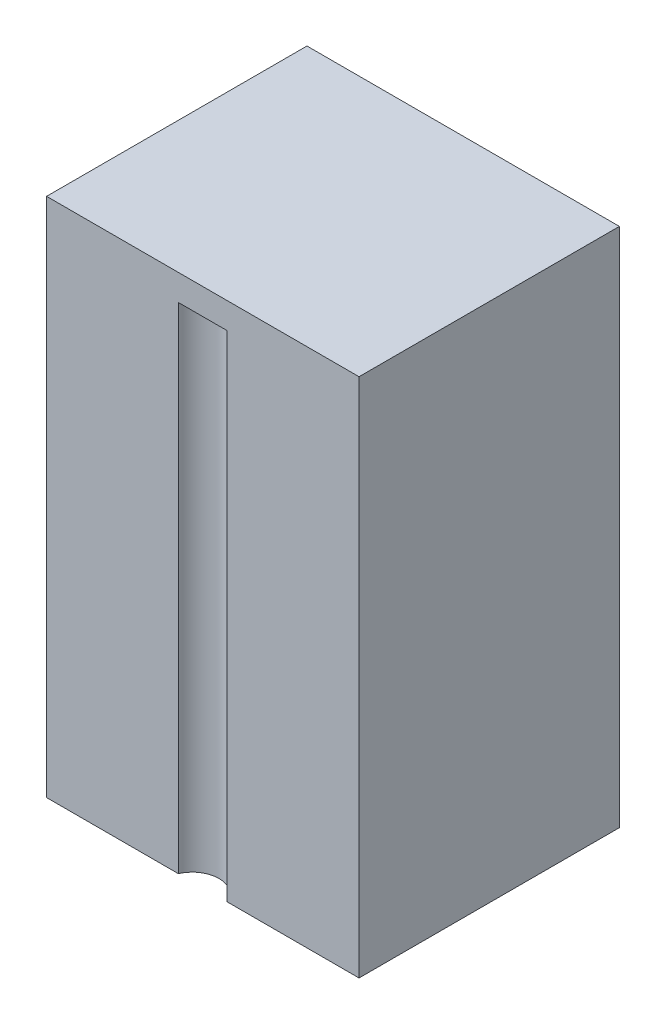
ISO-10303-21;
HEADER;
FILE_DESCRIPTION(('STEP AP214'),'2;1');
FILE_NAME('part.step','',(''),(''),'','','');
FILE_SCHEMA(('AUTOMOTIVE_DESIGN { 1 0 10303 214 1 1 1 1 }'));
ENDSEC;
DATA;
#1=APPLICATION_CONTEXT('core data for automotive mechanical design processes');
#2=APPLICATION_PROTOCOL_DEFINITION('international standard','automotive_design',2000,#1);
#3=PRODUCT_CONTEXT('',#1,'mechanical');
#4=PRODUCT('Part','Part','',(#3));
#5=PRODUCT_RELATED_PRODUCT_CATEGORY('part','',(#4));
#6=PRODUCT_DEFINITION_FORMATION('','',#4);
#7=PRODUCT_DEFINITION_CONTEXT('part definition',#1,'design');
#8=PRODUCT_DEFINITION('design','',#6,#7);
#9=PRODUCT_DEFINITION_SHAPE('','',#8);
#10=(LENGTH_UNIT() NAMED_UNIT(*) SI_UNIT(.MILLI.,.METRE.));
#11=(NAMED_UNIT(*) PLANE_ANGLE_UNIT() SI_UNIT($,.RADIAN.));
#12=(NAMED_UNIT(*) SI_UNIT($,.STERADIAN.) SOLID_ANGLE_UNIT());
#13=UNCERTAINTY_MEASURE_WITH_UNIT(LENGTH_MEASURE(1.E-05),#10,'distance_accuracy_value','');
#14=(GEOMETRIC_REPRESENTATION_CONTEXT(3) GLOBAL_UNCERTAINTY_ASSIGNED_CONTEXT((#13)) GLOBAL_UNIT_ASSIGNED_CONTEXT((#10,
#11,#12)) REPRESENTATION_CONTEXT('',''));
#15=CARTESIAN_POINT('',(0.,0.,0.));
#16=DIRECTION('',(0.,0.,1.));
#17=DIRECTION('',(1.,0.,0.));
#18=AXIS2_PLACEMENT_3D('',#15,#16,#17);
#19=CARTESIAN_POINT('',(-15.,50.,12.5));
#20=DIRECTION('',(0.,0.,-1.));
#21=DIRECTION('',(-1.,0.,0.));
#22=AXIS2_PLACEMENT_3D('',#19,#20,#21);
#23=PLANE('',#22);
#24=DIRECTION('',(0.,1.,0.));
#25=VECTOR('',#24,1.);
#26=CARTESIAN_POINT('',(-2.34574082114798,-7.21248916810278,12.5));
#27=LINE('',#26,#25);
#28=CARTESIAN_POINT('',(-2.34574082114798,47.5,12.5));
#29=VERTEX_POINT('',#28);
#30=CARTESIAN_POINT('',(-2.34574082114798,0.,12.5));
#31=VERTEX_POINT('',#30);
#32=EDGE_CURVE('E159',#29,#31,#27,.F.);
#33=ORIENTED_EDGE('',*,*,#32,.F.);
#34=DIRECTION('',(-1.,0.,0.));
#35=VECTOR('',#34,1.);
#36=CARTESIAN_POINT('',(-15.,47.5,12.5));
#37=LINE('',#36,#35);
#38=CARTESIAN_POINT('',(2.34574082114798,47.5,12.5));
#39=VERTEX_POINT('',#38);
#40=EDGE_CURVE('E11',#39,#29,#37,.T.);
#41=ORIENTED_EDGE('',*,*,#40,.F.);
#42=DIRECTION('',(0.,1.,0.));
#43=VECTOR('',#42,1.);
#44=CARTESIAN_POINT('',(2.34574082114798,-7.21248916810278,12.5));
#45=LINE('',#44,#43);
#46=CARTESIAN_POINT('',(2.34574082114798,0.,12.5));
#47=VERTEX_POINT('',#46);
#48=EDGE_CURVE('E252',#47,#39,#45,.T.);
#49=ORIENTED_EDGE('',*,*,#48,.F.);
#50=DIRECTION('',(1.,0.,0.));
#51=VECTOR('',#50,1.);
#52=CARTESIAN_POINT('',(-15.,0.,12.5));
#53=LINE('',#52,#51);
#54=CARTESIAN_POINT('',(15.,0.,12.5));
#55=VERTEX_POINT('',#54);
#56=EDGE_CURVE('E218',#47,#55,#53,.T.);
#57=ORIENTED_EDGE('',*,*,#56,.T.);
#58=DIRECTION('',(0.,-1.,0.));
#59=VECTOR('',#58,1.);
#60=CARTESIAN_POINT('',(15.,50.,12.5));
#61=LINE('',#60,#59);
#62=CARTESIAN_POINT('',(15.,50.,12.5));
#63=VERTEX_POINT('',#62);
#64=EDGE_CURVE('E223',#63,#55,#61,.T.);
#65=ORIENTED_EDGE('',*,*,#64,.F.);
#66=DIRECTION('',(1.,0.,0.));
#67=VECTOR('',#66,1.);
#68=CARTESIAN_POINT('',(-15.,50.,12.5));
#69=LINE('',#68,#67);
#70=CARTESIAN_POINT('',(-15.,50.,12.5));
#71=VERTEX_POINT('',#70);
#72=EDGE_CURVE('E207',#71,#63,#69,.T.);
#73=ORIENTED_EDGE('',*,*,#72,.F.);
#74=DIRECTION('',(0.,-1.,0.));
#75=VECTOR('',#74,1.);
#76=CARTESIAN_POINT('',(-15.,50.,12.5));
#77=LINE('',#76,#75);
#78=CARTESIAN_POINT('',(-15.,0.,12.5));
#79=VERTEX_POINT('',#78);
#80=EDGE_CURVE('E221',#71,#79,#77,.T.);
#81=ORIENTED_EDGE('',*,*,#80,.T.);
#82=EDGE_CURVE('E202',#79,#31,#53,.T.);
#83=ORIENTED_EDGE('',*,*,#82,.T.);
#84=EDGE_LOOP('',(#33,#41,#49,#57,#65,#73,#81,#83));
#85=FACE_BOUND('',#84,.T.);
#86=ADVANCED_FACE('F40',(#85),#23,.F.);
#87=CARTESIAN_POINT('',(-15.,50.,12.5));
#88=DIRECTION('',(-1.,0.,0.));
#89=DIRECTION('',(0.,0.,1.));
#90=AXIS2_PLACEMENT_3D('',#87,#88,#89);
#91=PLANE('',#90);
#92=DIRECTION('',(0.,0.,-1.));
#93=VECTOR('',#92,1.);
#94=CARTESIAN_POINT('',(-15.,0.,12.5));
#95=LINE('',#94,#93);
#96=CARTESIAN_POINT('',(-15.,0.,-12.5));
#97=VERTEX_POINT('',#96);
#98=EDGE_CURVE('E197',#79,#97,#95,.T.);
#99=ORIENTED_EDGE('',*,*,#98,.F.);
#100=ORIENTED_EDGE('',*,*,#80,.F.);
#101=DIRECTION('',(0.,0.,-1.));
#102=VECTOR('',#101,1.);
#103=CARTESIAN_POINT('',(-15.,50.,12.5));
#104=LINE('',#103,#102);
#105=CARTESIAN_POINT('',(-15.,50.,-12.5));
#106=VERTEX_POINT('',#105);
#107=EDGE_CURVE('E198',#71,#106,#104,.T.);
#108=ORIENTED_EDGE('',*,*,#107,.T.);
#109=DIRECTION('',(0.,-1.,0.));
#110=VECTOR('',#109,1.);
#111=CARTESIAN_POINT('',(-15.,50.,-12.5));
#112=LINE('',#111,#110);
#113=EDGE_CURVE('E209',#106,#97,#112,.T.);
#114=ORIENTED_EDGE('',*,*,#113,.T.);
#115=EDGE_LOOP('',(#99,#100,#108,#114));
#116=FACE_BOUND('',#115,.T.);
#117=ADVANCED_FACE('F42',(#116),#91,.T.);
#118=CARTESIAN_POINT('',(15.,50.,12.5));
#119=DIRECTION('',(-1.,0.,0.));
#120=DIRECTION('',(0.,0.,1.));
#121=AXIS2_PLACEMENT_3D('',#118,#119,#120);
#122=PLANE('',#121);
#123=DIRECTION('',(0.,0.,-1.));
#124=VECTOR('',#123,1.);
#125=CARTESIAN_POINT('',(15.,0.,12.5));
#126=LINE('',#125,#124);
#127=CARTESIAN_POINT('',(15.,0.,-12.5));
#128=VERTEX_POINT('',#127);
#129=EDGE_CURVE('E215',#55,#128,#126,.T.);
#130=ORIENTED_EDGE('',*,*,#129,.T.);
#131=DIRECTION('',(0.,-1.,0.));
#132=VECTOR('',#131,1.);
#133=CARTESIAN_POINT('',(15.,50.,-12.5));
#134=LINE('',#133,#132);
#135=CARTESIAN_POINT('',(15.,50.,-12.5));
#136=VERTEX_POINT('',#135);
#137=EDGE_CURVE('E226',#136,#128,#134,.T.);
#138=ORIENTED_EDGE('',*,*,#137,.F.);
#139=DIRECTION('',(0.,0.,-1.));
#140=VECTOR('',#139,1.);
#141=CARTESIAN_POINT('',(15.,50.,12.5));
#142=LINE('',#141,#140);
#143=EDGE_CURVE('E205',#63,#136,#142,.T.);
#144=ORIENTED_EDGE('',*,*,#143,.F.);
#145=ORIENTED_EDGE('',*,*,#64,.T.);
#146=EDGE_LOOP('',(#130,#138,#144,#145));
#147=FACE_BOUND('',#146,.T.);
#148=ADVANCED_FACE('F251',(#147),#122,.F.);
#149=CARTESIAN_POINT('',(-15.,50.,-12.5));
#150=DIRECTION('',(0.,0.,-1.));
#151=DIRECTION('',(-1.,0.,0.));
#152=AXIS2_PLACEMENT_3D('',#149,#150,#151);
#153=PLANE('',#152);
#154=DIRECTION('',(1.,0.,0.));
#155=VECTOR('',#154,1.);
#156=CARTESIAN_POINT('',(-15.,0.,-12.5));
#157=LINE('',#156,#155);
#158=EDGE_CURVE('E212',#97,#128,#157,.T.);
#159=ORIENTED_EDGE('',*,*,#158,.F.);
#160=ORIENTED_EDGE('',*,*,#113,.F.);
#161=DIRECTION('',(1.,0.,0.));
#162=VECTOR('',#161,1.);
#163=CARTESIAN_POINT('',(-15.,50.,-12.5));
#164=LINE('',#163,#162);
#165=EDGE_CURVE('E201',#106,#136,#164,.T.);
#166=ORIENTED_EDGE('',*,*,#165,.T.);
#167=ORIENTED_EDGE('',*,*,#137,.T.);
#168=EDGE_LOOP('',(#159,#160,#166,#167));
#169=FACE_BOUND('',#168,.T.);
#170=ADVANCED_FACE('F246',(#169),#153,.T.);
#171=CARTESIAN_POINT('',(0.,50.,0.));
#172=DIRECTION('',(0.,-1.,0.));
#173=DIRECTION('',(0.,0.,-1.));
#174=AXIS2_PLACEMENT_3D('',#171,#172,#173);
#175=PLANE('',#174);
#176=ORIENTED_EDGE('',*,*,#107,.F.);
#177=ORIENTED_EDGE('',*,*,#72,.T.);
#178=ORIENTED_EDGE('',*,*,#143,.T.);
#179=ORIENTED_EDGE('',*,*,#165,.F.);
#180=EDGE_LOOP('',(#176,#177,#178,#179));
#181=FACE_BOUND('',#180,.T.);
#182=ADVANCED_FACE('F305',(#181),#175,.F.);
#183=CARTESIAN_POINT('',(0.,0.,0.));
#184=DIRECTION('',(0.,-1.,0.));
#185=DIRECTION('',(0.,0.,-1.));
#186=AXIS2_PLACEMENT_3D('',#183,#184,#185);
#187=PLANE('',#186);
#188=ORIENTED_EDGE('',*,*,#56,.F.);
#189=CARTESIAN_POINT('',(0.,0.,13.5));
#190=DIRECTION('',(0.,-1.,0.));
#191=DIRECTION('',(0.,0.,-1.));
#192=AXIS2_PLACEMENT_3D('',#189,#190,#191);
#193=CIRCLE('',#192,2.55);
#194=EDGE_CURVE('E48',#47,#31,#193,.F.);
#195=ORIENTED_EDGE('',*,*,#194,.T.);
#196=ORIENTED_EDGE('',*,*,#82,.F.);
#197=ORIENTED_EDGE('',*,*,#98,.T.);
#198=ORIENTED_EDGE('',*,*,#158,.T.);
#199=ORIENTED_EDGE('',*,*,#129,.F.);
#200=EDGE_LOOP('',(#188,#195,#196,#197,#198,#199));
#201=FACE_BOUND('',#200,.T.);
#202=ADVANCED_FACE('F232',(#201),#187,.T.);
#203=CARTESIAN_POINT('',(0.,47.5,13.5));
#204=DIRECTION('',(0.,-1.,0.));
#205=DIRECTION('',(0.,0.,-1.));
#206=AXIS2_PLACEMENT_3D('',#203,#204,#205);
#207=PLANE('',#206);
#208=ORIENTED_EDGE('',*,*,#40,.T.);
#209=CARTESIAN_POINT('',(0.,47.5,13.5));
#210=DIRECTION('',(0.,-1.,0.));
#211=DIRECTION('',(0.,0.,-1.));
#212=AXIS2_PLACEMENT_3D('',#209,#210,#211);
#213=CIRCLE('',#212,2.55);
#214=EDGE_CURVE('E255',#29,#39,#213,.T.);
#215=ORIENTED_EDGE('',*,*,#214,.T.);
#216=EDGE_LOOP('',(#208,#215));
#217=FACE_BOUND('',#216,.T.);
#218=ADVANCED_FACE('F311',(#217),#207,.T.);
#219=CARTESIAN_POINT('',(0.,-7.21248916810278,13.5));
#220=DIRECTION('',(0.,1.,0.));
#221=DIRECTION('',(0.,0.,1.));
#222=AXIS2_PLACEMENT_3D('',#219,#220,#221);
#223=CYLINDRICAL_SURFACE('',#222,2.55);
#224=ORIENTED_EDGE('',*,*,#32,.T.);
#225=ORIENTED_EDGE('',*,*,#194,.F.);
#226=ORIENTED_EDGE('',*,*,#48,.T.);
#227=ORIENTED_EDGE('',*,*,#214,.F.);
#228=EDGE_LOOP('',(#224,#225,#226,#227));
#229=FACE_BOUND('',#228,.T.);
#230=ADVANCED_FACE('F336',(#229),#223,.F.);
#231=CLOSED_SHELL('',(#86,#117,#148,#170,#182,#202,#218,#230));
#232=CARTESIAN_POINT('',(-12.5,47.5,0.));
#233=DIRECTION('',(-1.,0.,0.));
#234=DIRECTION('',(0.,0.,1.));
#235=AXIS2_PLACEMENT_3D('',#232,#233,#234);
#236=PLANE('',#235);
#237=DIRECTION('',(0.,-1.,0.));
#238=VECTOR('',#237,1.);
#239=CARTESIAN_POINT('',(-12.5,47.5,10.));
#240=LINE('',#239,#238);
#241=CARTESIAN_POINT('',(-12.5,47.5,10.));
#242=VERTEX_POINT('',#241);
#243=CARTESIAN_POINT('',(-12.5,2.5,10.));
#244=VERTEX_POINT('',#243);
#245=EDGE_CURVE('E195',#242,#244,#240,.T.);
#246=ORIENTED_EDGE('',*,*,#245,.T.);
#247=DIRECTION('',(0.,0.,-1.));
#248=VECTOR('',#247,1.);
#249=CARTESIAN_POINT('',(-12.5,2.5,0.));
#250=LINE('',#249,#248);
#251=CARTESIAN_POINT('',(-12.5,2.5,-10.));
#252=VERTEX_POINT('',#251);
#253=EDGE_CURVE('E175',#244,#252,#250,.T.);
#254=ORIENTED_EDGE('',*,*,#253,.T.);
#255=DIRECTION('',(0.,-1.,0.));
#256=VECTOR('',#255,1.);
#257=CARTESIAN_POINT('',(-12.5,47.5,-10.));
#258=LINE('',#257,#256);
#259=CARTESIAN_POINT('',(-12.5,25.,-10.));
#260=VERTEX_POINT('',#259);
#261=EDGE_CURVE('E174',#260,#252,#258,.T.);
#262=ORIENTED_EDGE('',*,*,#261,.F.);
#263=DIRECTION('',(0.,0.,-1.));
#264=VECTOR('',#263,1.);
#265=CARTESIAN_POINT('',(-12.5,25.,0.));
#266=LINE('',#265,#264);
#267=CARTESIAN_POINT('',(-12.5,25.,5.));
#268=VERTEX_POINT('',#267);
#269=EDGE_CURVE('E155',#268,#260,#266,.T.);
#270=ORIENTED_EDGE('',*,*,#269,.F.);
#271=DIRECTION('',(0.,1.,0.));
#272=VECTOR('',#271,1.);
#273=CARTESIAN_POINT('',(-12.5,25.,5.));
#274=LINE('',#273,#272);
#275=CARTESIAN_POINT('',(-12.5,26.,5.));
#276=VERTEX_POINT('',#275);
#277=EDGE_CURVE('E55',#268,#276,#274,.T.);
#278=ORIENTED_EDGE('',*,*,#277,.T.);
#279=DIRECTION('',(0.,0.,-1.));
#280=VECTOR('',#279,1.);
#281=CARTESIAN_POINT('',(-12.5,26.,0.));
#282=LINE('',#281,#280);
#283=CARTESIAN_POINT('',(-12.5,26.,-10.));
#284=VERTEX_POINT('',#283);
#285=EDGE_CURVE('E157',#276,#284,#282,.T.);
#286=ORIENTED_EDGE('',*,*,#285,.T.);
#287=CARTESIAN_POINT('',(-12.5,47.5,-10.));
#288=VERTEX_POINT('',#287);
#289=EDGE_CURVE('E187',#288,#284,#258,.T.);
#290=ORIENTED_EDGE('',*,*,#289,.F.);
#291=DIRECTION('',(0.,0.,-1.));
#292=VECTOR('',#291,1.);
#293=CARTESIAN_POINT('',(-12.5,47.5,0.));
#294=LINE('',#293,#292);
#295=EDGE_CURVE('E163',#242,#288,#294,.T.);
#296=ORIENTED_EDGE('',*,*,#295,.F.);
#297=EDGE_LOOP('',(#246,#254,#262,#270,#278,#286,#290,#296));
#298=FACE_BOUND('',#297,.T.);
#299=ADVANCED_FACE('F277',(#298),#236,.F.);
#300=CARTESIAN_POINT('',(0.,47.5,10.));
#301=DIRECTION('',(0.,0.,-1.));
#302=DIRECTION('',(-1.,0.,0.));
#303=AXIS2_PLACEMENT_3D('',#300,#301,#302);
#304=PLANE('',#303);
#305=DIRECTION('',(0.,-1.,0.));
#306=VECTOR('',#305,1.);
#307=CARTESIAN_POINT('',(12.5,47.5,10.));
#308=LINE('',#307,#306);
#309=CARTESIAN_POINT('',(12.5,47.5,10.));
#310=VERTEX_POINT('',#309);
#311=CARTESIAN_POINT('',(12.5,2.5,10.));
#312=VERTEX_POINT('',#311);
#313=EDGE_CURVE('E193',#310,#312,#308,.T.);
#314=ORIENTED_EDGE('',*,*,#313,.T.);
#315=DIRECTION('',(1.,0.,0.));
#316=VECTOR('',#315,1.);
#317=CARTESIAN_POINT('',(0.,2.5,10.));
#318=LINE('',#317,#316);
#319=EDGE_CURVE('E178',#244,#312,#318,.T.);
#320=ORIENTED_EDGE('',*,*,#319,.F.);
#321=ORIENTED_EDGE('',*,*,#245,.F.);
#322=DIRECTION('',(1.,0.,0.));
#323=VECTOR('',#322,1.);
#324=CARTESIAN_POINT('',(0.,47.5,10.));
#325=LINE('',#324,#323);
#326=EDGE_CURVE('E166',#242,#310,#325,.T.);
#327=ORIENTED_EDGE('',*,*,#326,.T.);
#328=EDGE_LOOP('',(#314,#320,#321,#327));
#329=FACE_BOUND('',#328,.T.);
#330=ADVANCED_FACE('F295',(#329),#304,.T.);
#331=CARTESIAN_POINT('',(12.5,47.5,0.));
#332=DIRECTION('',(-1.,0.,0.));
#333=DIRECTION('',(0.,0.,1.));
#334=AXIS2_PLACEMENT_3D('',#331,#332,#333);
#335=PLANE('',#334);
#336=DIRECTION('',(0.,0.,-1.));
#337=VECTOR('',#336,1.);
#338=CARTESIAN_POINT('',(12.5,26.,0.));
#339=LINE('',#338,#337);
#340=CARTESIAN_POINT('',(12.5,26.,5.));
#341=VERTEX_POINT('',#340);
#342=CARTESIAN_POINT('',(12.5,26.,-10.));
#343=VERTEX_POINT('',#342);
#344=EDGE_CURVE('E143',#341,#343,#339,.T.);
#345=ORIENTED_EDGE('',*,*,#344,.F.);
#346=DIRECTION('',(0.,1.,0.));
#347=VECTOR('',#346,1.);
#348=CARTESIAN_POINT('',(12.5,25.,5.));
#349=LINE('',#348,#347);
#350=CARTESIAN_POINT('',(12.5,25.,5.));
#351=VERTEX_POINT('',#350);
#352=EDGE_CURVE('E60',#351,#341,#349,.T.);
#353=ORIENTED_EDGE('',*,*,#352,.F.);
#354=DIRECTION('',(0.,0.,-1.));
#355=VECTOR('',#354,1.);
#356=CARTESIAN_POINT('',(12.5,25.,0.));
#357=LINE('',#356,#355);
#358=CARTESIAN_POINT('',(12.5,25.,-10.));
#359=VERTEX_POINT('',#358);
#360=EDGE_CURVE('E140',#351,#359,#357,.T.);
#361=ORIENTED_EDGE('',*,*,#360,.T.);
#362=DIRECTION('',(0.,-1.,0.));
#363=VECTOR('',#362,1.);
#364=CARTESIAN_POINT('',(12.5,47.5,-10.));
#365=LINE('',#364,#363);
#366=CARTESIAN_POINT('',(12.5,2.5,-10.));
#367=VERTEX_POINT('',#366);
#368=EDGE_CURVE('E190',#359,#367,#365,.T.);
#369=ORIENTED_EDGE('',*,*,#368,.T.);
#370=DIRECTION('',(0.,0.,-1.));
#371=VECTOR('',#370,1.);
#372=CARTESIAN_POINT('',(12.5,2.5,0.));
#373=LINE('',#372,#371);
#374=EDGE_CURVE('E182',#312,#367,#373,.T.);
#375=ORIENTED_EDGE('',*,*,#374,.F.);
#376=ORIENTED_EDGE('',*,*,#313,.F.);
#377=DIRECTION('',(0.,0.,-1.));
#378=VECTOR('',#377,1.);
#379=CARTESIAN_POINT('',(12.5,47.5,0.));
#380=LINE('',#379,#378);
#381=CARTESIAN_POINT('',(12.5,47.5,-10.));
#382=VERTEX_POINT('',#381);
#383=EDGE_CURVE('E169',#310,#382,#380,.T.);
#384=ORIENTED_EDGE('',*,*,#383,.T.);
#385=EDGE_CURVE('E191',#382,#343,#365,.T.);
#386=ORIENTED_EDGE('',*,*,#385,.T.);
#387=EDGE_LOOP('',(#345,#353,#361,#369,#375,#376,#384,#386));
#388=FACE_BOUND('',#387,.T.);
#389=ADVANCED_FACE('F138',(#388),#335,.T.);
#390=CARTESIAN_POINT('',(0.,47.5,-10.));
#391=DIRECTION('',(0.,0.,-1.));
#392=DIRECTION('',(-1.,0.,0.));
#393=AXIS2_PLACEMENT_3D('',#390,#391,#392);
#394=PLANE('',#393);
#395=ORIENTED_EDGE('',*,*,#289,.T.);
#396=DIRECTION('',(1.,0.,0.));
#397=VECTOR('',#396,1.);
#398=CARTESIAN_POINT('',(0.,26.,-10.));
#399=LINE('',#398,#397);
#400=EDGE_CURVE('E179',#284,#343,#399,.T.);
#401=ORIENTED_EDGE('',*,*,#400,.T.);
#402=ORIENTED_EDGE('',*,*,#385,.F.);
#403=DIRECTION('',(1.,0.,0.));
#404=VECTOR('',#403,1.);
#405=CARTESIAN_POINT('',(0.,47.5,-10.));
#406=LINE('',#405,#404);
#407=EDGE_CURVE('E171',#288,#382,#406,.T.);
#408=ORIENTED_EDGE('',*,*,#407,.F.);
#409=EDGE_LOOP('',(#395,#401,#402,#408));
#410=FACE_BOUND('',#409,.T.);
#411=ADVANCED_FACE('F265',(#410),#394,.F.);
#412=CARTESIAN_POINT('',(0.,47.5,0.));
#413=DIRECTION('',(0.,1.,0.));
#414=DIRECTION('',(0.,0.,1.));
#415=AXIS2_PLACEMENT_3D('',#412,#413,#414);
#416=PLANE('',#415);
#417=ORIENTED_EDGE('',*,*,#295,.T.);
#418=ORIENTED_EDGE('',*,*,#407,.T.);
#419=ORIENTED_EDGE('',*,*,#383,.F.);
#420=ORIENTED_EDGE('',*,*,#326,.F.);
#421=EDGE_LOOP('',(#417,#418,#419,#420));
#422=FACE_BOUND('',#421,.T.);
#423=ADVANCED_FACE('F274',(#422),#416,.F.);
#424=CARTESIAN_POINT('',(0.,26.,0.));
#425=DIRECTION('',(0.,1.,0.));
#426=DIRECTION('',(0.,0.,1.));
#427=AXIS2_PLACEMENT_3D('',#424,#425,#426);
#428=PLANE('',#427);
#429=DIRECTION('',(-1.,0.,0.));
#430=VECTOR('',#429,1.);
#431=CARTESIAN_POINT('',(12.5,26.,5.));
#432=LINE('',#431,#430);
#433=EDGE_CURVE('E149',#341,#276,#432,.T.);
#434=ORIENTED_EDGE('',*,*,#433,.F.);
#435=ORIENTED_EDGE('',*,*,#344,.T.);
#436=ORIENTED_EDGE('',*,*,#400,.F.);
#437=ORIENTED_EDGE('',*,*,#285,.F.);
#438=EDGE_LOOP('',(#434,#435,#436,#437));
#439=FACE_BOUND('',#438,.T.);
#440=ADVANCED_FACE('F279',(#439),#428,.T.);
#441=CARTESIAN_POINT('',(12.5,25.,5.));
#442=DIRECTION('',(0.,0.,-1.));
#443=DIRECTION('',(-1.,0.,0.));
#444=AXIS2_PLACEMENT_3D('',#441,#442,#443);
#445=PLANE('',#444);
#446=ORIENTED_EDGE('',*,*,#433,.T.);
#447=ORIENTED_EDGE('',*,*,#277,.F.);
#448=DIRECTION('',(-1.,0.,0.));
#449=VECTOR('',#448,1.);
#450=CARTESIAN_POINT('',(12.5,25.,5.));
#451=LINE('',#450,#449);
#452=EDGE_CURVE('E144',#351,#268,#451,.T.);
#453=ORIENTED_EDGE('',*,*,#452,.F.);
#454=ORIENTED_EDGE('',*,*,#352,.T.);
#455=EDGE_LOOP('',(#446,#447,#453,#454));
#456=FACE_BOUND('',#455,.T.);
#457=ADVANCED_FACE('F146',(#456),#445,.F.);
#458=CARTESIAN_POINT('',(0.,25.,0.));
#459=DIRECTION('',(0.,1.,0.));
#460=DIRECTION('',(0.,0.,1.));
#461=AXIS2_PLACEMENT_3D('',#458,#459,#460);
#462=PLANE('',#461);
#463=ORIENTED_EDGE('',*,*,#360,.F.);
#464=ORIENTED_EDGE('',*,*,#452,.T.);
#465=ORIENTED_EDGE('',*,*,#269,.T.);
#466=DIRECTION('',(1.,0.,0.));
#467=VECTOR('',#466,1.);
#468=CARTESIAN_POINT('',(0.,25.,-10.));
#469=LINE('',#468,#467);
#470=EDGE_CURVE('E154',#260,#359,#469,.T.);
#471=ORIENTED_EDGE('',*,*,#470,.T.);
#472=EDGE_LOOP('',(#463,#464,#465,#471));
#473=FACE_BOUND('',#472,.T.);
#474=ADVANCED_FACE('F152',(#473),#462,.F.);
#475=CARTESIAN_POINT('',(0.,2.5,0.));
#476=DIRECTION('',(0.,1.,0.));
#477=DIRECTION('',(0.,0.,1.));
#478=AXIS2_PLACEMENT_3D('',#475,#476,#477);
#479=PLANE('',#478);
#480=ORIENTED_EDGE('',*,*,#253,.F.);
#481=ORIENTED_EDGE('',*,*,#319,.T.);
#482=ORIENTED_EDGE('',*,*,#374,.T.);
#483=DIRECTION('',(1.,0.,0.));
#484=VECTOR('',#483,1.);
#485=CARTESIAN_POINT('',(0.,2.5,-10.));
#486=LINE('',#485,#484);
#487=EDGE_CURVE('E167',#252,#367,#486,.T.);
#488=ORIENTED_EDGE('',*,*,#487,.F.);
#489=EDGE_LOOP('',(#480,#481,#482,#488));
#490=FACE_BOUND('',#489,.T.);
#491=ADVANCED_FACE('F383',(#490),#479,.T.);
#492=ORIENTED_EDGE('',*,*,#470,.F.);
#493=ORIENTED_EDGE('',*,*,#261,.T.);
#494=ORIENTED_EDGE('',*,*,#487,.T.);
#495=ORIENTED_EDGE('',*,*,#368,.F.);
#496=EDGE_LOOP('',(#492,#493,#494,#495));
#497=FACE_BOUND('',#496,.T.);
#498=ADVANCED_FACE('F392',(#497),#394,.F.);
#499=CLOSED_SHELL('',(#299,#330,#389,#411,#423,#440,#457,#474,#491,#498));
#500=ORIENTED_CLOSED_SHELL('',*,#499,.T.);
#501=BREP_WITH_VOIDS('B2',#231,(#500));
#502=ADVANCED_BREP_SHAPE_REPRESENTATION('',(#18,#501),#14);
#503=SHAPE_DEFINITION_REPRESENTATION(#9,#502);
ENDSEC;
END-ISO-10303-21;
